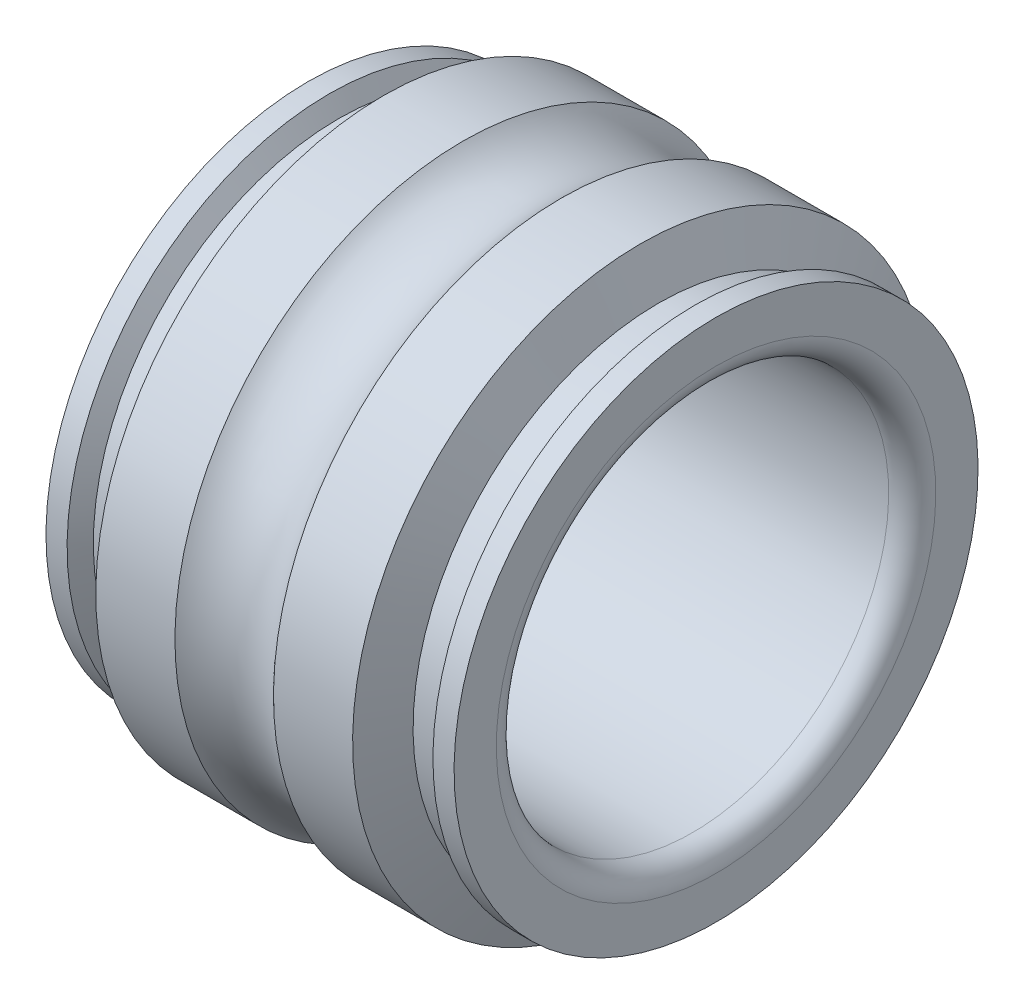
ISO-10303-21;
HEADER;
FILE_DESCRIPTION(('STEP AP214'),'2;1');
FILE_NAME('part.step','',(''),(''),'','','');
FILE_SCHEMA(('AUTOMOTIVE_DESIGN { 1 0 10303 214 1 1 1 1 }'));
ENDSEC;
DATA;
#1=APPLICATION_CONTEXT('core data for automotive mechanical design processes');
#2=APPLICATION_PROTOCOL_DEFINITION('international standard','automotive_design',2000,#1);
#3=PRODUCT_CONTEXT('',#1,'mechanical');
#4=PRODUCT('Part','Part','',(#3));
#5=PRODUCT_RELATED_PRODUCT_CATEGORY('part','',(#4));
#6=PRODUCT_DEFINITION_FORMATION('','',#4);
#7=PRODUCT_DEFINITION_CONTEXT('part definition',#1,'design');
#8=PRODUCT_DEFINITION('design','',#6,#7);
#9=PRODUCT_DEFINITION_SHAPE('','',#8);
#10=(LENGTH_UNIT() NAMED_UNIT(*) SI_UNIT(.MILLI.,.METRE.));
#11=(NAMED_UNIT(*) PLANE_ANGLE_UNIT() SI_UNIT($,.RADIAN.));
#12=(NAMED_UNIT(*) SI_UNIT($,.STERADIAN.) SOLID_ANGLE_UNIT());
#13=UNCERTAINTY_MEASURE_WITH_UNIT(LENGTH_MEASURE(1.E-05),#10,'distance_accuracy_value','');
#14=(GEOMETRIC_REPRESENTATION_CONTEXT(3) GLOBAL_UNCERTAINTY_ASSIGNED_CONTEXT((#13)) GLOBAL_UNIT_ASSIGNED_CONTEXT((#10,
#11,#12)) REPRESENTATION_CONTEXT('',''));
#15=CARTESIAN_POINT('',(0.,0.,0.));
#16=DIRECTION('',(0.,0.,1.));
#17=DIRECTION('',(1.,0.,0.));
#18=AXIS2_PLACEMENT_3D('',#15,#16,#17);
#19=CARTESIAN_POINT('',(-1.01853146853147,0.,0.));
#20=DIRECTION('',(-1.,0.,0.));
#21=DIRECTION('',(0.,1.,0.));
#22=AXIS2_PLACEMENT_3D('',#19,#20,#21);
#23=CYLINDRICAL_SURFACE('',#22,1.56324863939701);
#24=CARTESIAN_POINT('',(-1.1041958041958,0.,0.));
#25=DIRECTION('',(1.,0.,0.));
#26=DIRECTION('',(0.,1.,0.));
#27=AXIS2_PLACEMENT_3D('',#24,#25,#26);
#28=CIRCLE('',#27,1.56324863939701);
#29=CARTESIAN_POINT('',(-1.1041958041958,1.56324863939701,0.));
#30=VERTEX_POINT('',#29);
#31=EDGE_CURVE('E11',#30,#30,#28,.T.);
#32=ORIENTED_EDGE('',*,*,#31,.T.);
#33=EDGE_LOOP('',(#32));
#34=FACE_BOUND('',#33,.T.);
#35=CARTESIAN_POINT('',(-0.932867132867133,0.,0.));
#36=DIRECTION('',(1.,0.,0.));
#37=DIRECTION('',(0.,1.,0.));
#38=AXIS2_PLACEMENT_3D('',#35,#36,#37);
#39=CIRCLE('',#38,1.56324863939701);
#40=CARTESIAN_POINT('',(-0.932867132867133,1.56324863939701,0.));
#41=VERTEX_POINT('',#40);
#42=EDGE_CURVE('E56',#41,#41,#39,.T.);
#43=ORIENTED_EDGE('',*,*,#42,.F.);
#44=EDGE_LOOP('',(#43));
#45=FACE_BOUND('',#44,.T.);
#46=ADVANCED_FACE('F19',(#34,#45),#23,.T.);
#47=CARTESIAN_POINT('',(-1.13479020979021,0.,0.));
#48=DIRECTION('',(-1.,0.,0.));
#49=DIRECTION('',(0.,1.,0.));
#50=AXIS2_PLACEMENT_3D('',#47,#48,#49);
#51=CONICAL_SURFACE('',#50,1.61623970431389,1.0471975511966);
#52=CARTESIAN_POINT('',(-1.16538461538462,0.,0.));
#53=DIRECTION('',(1.,0.,0.));
#54=DIRECTION('',(0.,1.,0.));
#55=AXIS2_PLACEMENT_3D('',#52,#53,#54);
#56=CIRCLE('',#55,1.66923076923077);
#57=CARTESIAN_POINT('',(-1.16538461538462,1.66923076923077,0.));
#58=VERTEX_POINT('',#57);
#59=EDGE_CURVE('E29',#58,#58,#56,.T.);
#60=ORIENTED_EDGE('',*,*,#59,.T.);
#61=EDGE_LOOP('',(#60));
#62=FACE_BOUND('',#61,.T.);
#63=ORIENTED_EDGE('',*,*,#31,.F.);
#64=EDGE_LOOP('',(#63));
#65=FACE_BOUND('',#64,.T.);
#66=ADVANCED_FACE('F121',(#62,#65),#51,.T.);
#67=CARTESIAN_POINT('',(-1.23269230769231,0.,0.));
#68=DIRECTION('',(-1.,0.,0.));
#69=DIRECTION('',(0.,1.,0.));
#70=AXIS2_PLACEMENT_3D('',#67,#68,#69);
#71=CYLINDRICAL_SURFACE('',#70,1.66923076923077);
#72=CARTESIAN_POINT('',(-1.3,0.,0.));
#73=DIRECTION('',(1.,0.,0.));
#74=DIRECTION('',(0.,1.,0.));
#75=AXIS2_PLACEMENT_3D('',#72,#73,#74);
#76=CIRCLE('',#75,1.66923076923077);
#77=CARTESIAN_POINT('',(-1.3,1.66923076923077,0.));
#78=VERTEX_POINT('',#77);
#79=EDGE_CURVE('E70',#78,#78,#76,.T.);
#80=ORIENTED_EDGE('',*,*,#79,.T.);
#81=EDGE_LOOP('',(#80));
#82=FACE_BOUND('',#81,.T.);
#83=ORIENTED_EDGE('',*,*,#59,.F.);
#84=EDGE_LOOP('',(#83));
#85=FACE_BOUND('',#84,.T.);
#86=ADVANCED_FACE('F126',(#82,#85),#71,.T.);
#87=CARTESIAN_POINT('',(-1.3,1.53461538461538,0.));
#88=DIRECTION('',(-1.,0.,0.));
#89=DIRECTION('',(0.,-1.,0.));
#90=AXIS2_PLACEMENT_3D('',#87,#88,#89);
#91=PLANE('',#90);
#92=CARTESIAN_POINT('',(-1.3,0.,0.));
#93=DIRECTION('',(1.,0.,0.));
#94=DIRECTION('',(0.,1.,0.));
#95=AXIS2_PLACEMENT_3D('',#92,#93,#94);
#96=CIRCLE('',#95,1.4);
#97=CARTESIAN_POINT('',(-1.3,1.4,0.));
#98=VERTEX_POINT('',#97);
#99=EDGE_CURVE('E82',#98,#98,#96,.T.);
#100=ORIENTED_EDGE('',*,*,#99,.T.);
#101=EDGE_LOOP('',(#100));
#102=FACE_BOUND('',#101,.T.);
#103=ORIENTED_EDGE('',*,*,#79,.F.);
#104=EDGE_LOOP('',(#103));
#105=FACE_BOUND('',#104,.T.);
#106=ADVANCED_FACE('F155',(#102,#105),#91,.T.);
#107=CARTESIAN_POINT('',(-1.15,0.,0.));
#108=DIRECTION('',(1.,0.,0.));
#109=DIRECTION('',(0.,0.,-1.));
#110=AXIS2_PLACEMENT_3D('',#107,#108,#109);
#111=TOROIDAL_SURFACE('',#110,1.4,0.15);
#112=CARTESIAN_POINT('',(-1.15,0.,0.));
#113=DIRECTION('',(1.,0.,0.));
#114=DIRECTION('',(0.,1.,0.));
#115=AXIS2_PLACEMENT_3D('',#112,#113,#114);
#116=CIRCLE('',#115,1.25);
#117=CARTESIAN_POINT('',(-1.15,1.25,0.));
#118=VERTEX_POINT('',#117);
#119=EDGE_CURVE('E84',#118,#118,#116,.T.);
#120=ORIENTED_EDGE('',*,*,#119,.T.);
#121=EDGE_LOOP('',(#120));
#122=FACE_BOUND('',#121,.T.);
#123=ORIENTED_EDGE('',*,*,#99,.F.);
#124=EDGE_LOOP('',(#123));
#125=FACE_BOUND('',#124,.T.);
#126=ADVANCED_FACE('F134',(#122,#125),#111,.T.);
#127=CARTESIAN_POINT('',(0.,0.,0.));
#128=DIRECTION('',(-1.,0.,0.));
#129=DIRECTION('',(0.,1.,0.));
#130=AXIS2_PLACEMENT_3D('',#127,#128,#129);
#131=CYLINDRICAL_SURFACE('',#130,1.25);
#132=CARTESIAN_POINT('',(1.15,0.,0.));
#133=DIRECTION('',(1.,0.,0.));
#134=DIRECTION('',(0.,1.,0.));
#135=AXIS2_PLACEMENT_3D('',#132,#133,#134);
#136=CIRCLE('',#135,1.25);
#137=CARTESIAN_POINT('',(1.15,1.25,0.));
#138=VERTEX_POINT('',#137);
#139=EDGE_CURVE('E87',#138,#138,#136,.T.);
#140=ORIENTED_EDGE('',*,*,#139,.T.);
#141=EDGE_LOOP('',(#140));
#142=FACE_BOUND('',#141,.T.);
#143=ORIENTED_EDGE('',*,*,#119,.F.);
#144=EDGE_LOOP('',(#143));
#145=FACE_BOUND('',#144,.T.);
#146=ADVANCED_FACE('F131',(#142,#145),#131,.F.);
#147=CARTESIAN_POINT('',(1.15,0.,0.));
#148=DIRECTION('',(1.,0.,0.));
#149=DIRECTION('',(0.,0.,-1.));
#150=AXIS2_PLACEMENT_3D('',#147,#148,#149);
#151=TOROIDAL_SURFACE('',#150,1.4,0.15);
#152=CARTESIAN_POINT('',(1.3,0.,0.));
#153=DIRECTION('',(1.,0.,0.));
#154=DIRECTION('',(0.,1.,0.));
#155=AXIS2_PLACEMENT_3D('',#152,#153,#154);
#156=CIRCLE('',#155,1.4);
#157=CARTESIAN_POINT('',(1.3,1.4,0.));
#158=VERTEX_POINT('',#157);
#159=EDGE_CURVE('E89',#158,#158,#156,.T.);
#160=ORIENTED_EDGE('',*,*,#159,.T.);
#161=EDGE_LOOP('',(#160));
#162=FACE_BOUND('',#161,.T.);
#163=ORIENTED_EDGE('',*,*,#139,.F.);
#164=EDGE_LOOP('',(#163));
#165=FACE_BOUND('',#164,.T.);
#166=ADVANCED_FACE('F133',(#162,#165),#151,.T.);
#167=CARTESIAN_POINT('',(1.3,1.53461538461538,0.));
#168=DIRECTION('',(1.,0.,0.));
#169=DIRECTION('',(0.,1.,0.));
#170=AXIS2_PLACEMENT_3D('',#167,#168,#169);
#171=PLANE('',#170);
#172=CARTESIAN_POINT('',(1.3,0.,0.));
#173=DIRECTION('',(1.,0.,0.));
#174=DIRECTION('',(0.,1.,0.));
#175=AXIS2_PLACEMENT_3D('',#172,#173,#174);
#176=CIRCLE('',#175,1.66923076923077);
#177=CARTESIAN_POINT('',(1.3,1.66923076923077,0.));
#178=VERTEX_POINT('',#177);
#179=EDGE_CURVE('E80',#178,#178,#176,.T.);
#180=ORIENTED_EDGE('',*,*,#179,.T.);
#181=EDGE_LOOP('',(#180));
#182=FACE_BOUND('',#181,.T.);
#183=ORIENTED_EDGE('',*,*,#159,.F.);
#184=EDGE_LOOP('',(#183));
#185=FACE_BOUND('',#184,.T.);
#186=ADVANCED_FACE('F137',(#182,#185),#171,.T.);
#187=CARTESIAN_POINT('',(1.23269230769231,0.,0.));
#188=DIRECTION('',(-1.,0.,0.));
#189=DIRECTION('',(0.,1.,0.));
#190=AXIS2_PLACEMENT_3D('',#187,#188,#189);
#191=CYLINDRICAL_SURFACE('',#190,1.66923076923077);
#192=CARTESIAN_POINT('',(1.16538461538461,0.,0.));
#193=DIRECTION('',(1.,0.,0.));
#194=DIRECTION('',(0.,1.,0.));
#195=AXIS2_PLACEMENT_3D('',#192,#193,#194);
#196=CIRCLE('',#195,1.66923076923077);
#197=CARTESIAN_POINT('',(1.16538461538462,1.66923076923077,0.));
#198=VERTEX_POINT('',#197);
#199=EDGE_CURVE('E77',#198,#198,#196,.T.);
#200=ORIENTED_EDGE('',*,*,#199,.T.);
#201=EDGE_LOOP('',(#200));
#202=FACE_BOUND('',#201,.T.);
#203=ORIENTED_EDGE('',*,*,#179,.F.);
#204=EDGE_LOOP('',(#203));
#205=FACE_BOUND('',#204,.T.);
#206=ADVANCED_FACE('F142',(#202,#205),#191,.T.);
#207=CARTESIAN_POINT('',(1.13479020979021,0.,0.));
#208=DIRECTION('',(1.,0.,0.));
#209=DIRECTION('',(0.,1.,0.));
#210=AXIS2_PLACEMENT_3D('',#207,#208,#209);
#211=CONICAL_SURFACE('',#210,1.61623970431389,1.0471975511966);
#212=CARTESIAN_POINT('',(1.1041958041958,0.,0.));
#213=DIRECTION('',(1.,0.,0.));
#214=DIRECTION('',(0.,1.,0.));
#215=AXIS2_PLACEMENT_3D('',#212,#213,#214);
#216=CIRCLE('',#215,1.56324863939701);
#217=CARTESIAN_POINT('',(1.1041958041958,1.56324863939701,0.));
#218=VERTEX_POINT('',#217);
#219=EDGE_CURVE('E81',#218,#218,#216,.T.);
#220=ORIENTED_EDGE('',*,*,#219,.T.);
#221=EDGE_LOOP('',(#220));
#222=FACE_BOUND('',#221,.T.);
#223=ORIENTED_EDGE('',*,*,#199,.F.);
#224=EDGE_LOOP('',(#223));
#225=FACE_BOUND('',#224,.T.);
#226=ADVANCED_FACE('F116',(#222,#225),#211,.T.);
#227=CARTESIAN_POINT('',(1.01853146853147,0.,0.));
#228=DIRECTION('',(-1.,0.,0.));
#229=DIRECTION('',(0.,1.,0.));
#230=AXIS2_PLACEMENT_3D('',#227,#228,#229);
#231=CYLINDRICAL_SURFACE('',#230,1.56324863939701);
#232=CARTESIAN_POINT('',(0.932867132867133,0.,0.));
#233=DIRECTION('',(1.,0.,0.));
#234=DIRECTION('',(0.,1.,0.));
#235=AXIS2_PLACEMENT_3D('',#232,#233,#234);
#236=CIRCLE('',#235,1.56324863939701);
#237=CARTESIAN_POINT('',(0.932867132867133,1.56324863939701,0.));
#238=VERTEX_POINT('',#237);
#239=EDGE_CURVE('E23',#238,#238,#236,.T.);
#240=ORIENTED_EDGE('',*,*,#239,.T.);
#241=EDGE_LOOP('',(#240));
#242=FACE_BOUND('',#241,.T.);
#243=ORIENTED_EDGE('',*,*,#219,.F.);
#244=EDGE_LOOP('',(#243));
#245=FACE_BOUND('',#244,.T.);
#246=ADVANCED_FACE('F100',(#242,#245),#231,.T.);
#247=CARTESIAN_POINT('',(0.875487037075002,0.,0.));
#248=DIRECTION('',(-1.,0.,0.));
#249=DIRECTION('',(0.,1.,0.));
#250=AXIS2_PLACEMENT_3D('',#247,#248,#249);
#251=CONICAL_SURFACE('',#250,1.6984276738201,1.1693705988362);
#252=CARTESIAN_POINT('',(0.818106941282871,0.,0.));
#253=DIRECTION('',(1.,0.,0.));
#254=DIRECTION('',(0.,1.,0.));
#255=AXIS2_PLACEMENT_3D('',#252,#253,#254);
#256=CIRCLE('',#255,1.83360670824318);
#257=CARTESIAN_POINT('',(0.818106941282871,1.83360670824318,0.));
#258=VERTEX_POINT('',#257);
#259=EDGE_CURVE('E74',#258,#258,#256,.T.);
#260=ORIENTED_EDGE('',*,*,#259,.T.);
#261=EDGE_LOOP('',(#260));
#262=FACE_BOUND('',#261,.T.);
#263=ORIENTED_EDGE('',*,*,#239,.F.);
#264=EDGE_LOOP('',(#263));
#265=FACE_BOUND('',#264,.T.);
#266=ADVANCED_FACE('F104',(#262,#265),#251,.T.);
#267=CARTESIAN_POINT('',(0.566016372022163,0.,0.));
#268=DIRECTION('',(-1.,0.,0.));
#269=DIRECTION('',(0.,1.,0.));
#270=AXIS2_PLACEMENT_3D('',#267,#268,#269);
#271=CYLINDRICAL_SURFACE('',#270,1.83360670824318);
#272=CARTESIAN_POINT('',(0.313925802761455,0.,0.));
#273=DIRECTION('',(1.,0.,0.));
#274=DIRECTION('',(0.,1.,0.));
#275=AXIS2_PLACEMENT_3D('',#272,#273,#274);
#276=CIRCLE('',#275,1.83360670824318);
#277=CARTESIAN_POINT('',(0.313925802761455,1.83360670824318,0.));
#278=VERTEX_POINT('',#277);
#279=EDGE_CURVE('E72',#278,#278,#276,.T.);
#280=ORIENTED_EDGE('',*,*,#279,.T.);
#281=EDGE_LOOP('',(#280));
#282=FACE_BOUND('',#281,.T.);
#283=ORIENTED_EDGE('',*,*,#259,.F.);
#284=EDGE_LOOP('',(#283));
#285=FACE_BOUND('',#284,.T.);
#286=ADVANCED_FACE('F106',(#282,#285),#271,.T.);
#287=CARTESIAN_POINT('',(0.,0.,0.));
#288=DIRECTION('',(1.,0.,0.));
#289=DIRECTION('',(0.,0.,-1.));
#290=AXIS2_PLACEMENT_3D('',#287,#288,#289);
#291=TOROIDAL_SURFACE('',#290,2.125,0.428321678321679);
#292=CARTESIAN_POINT('',(-0.313925802761456,0.,0.));
#293=DIRECTION('',(1.,0.,0.));
#294=DIRECTION('',(0.,1.,0.));
#295=AXIS2_PLACEMENT_3D('',#292,#293,#294);
#296=CIRCLE('',#295,1.83360670824318);
#297=CARTESIAN_POINT('',(-0.313925802761456,1.83360670824318,0.));
#298=VERTEX_POINT('',#297);
#299=EDGE_CURVE('E66',#298,#298,#296,.T.);
#300=ORIENTED_EDGE('',*,*,#299,.T.);
#301=EDGE_LOOP('',(#300));
#302=FACE_BOUND('',#301,.T.);
#303=ORIENTED_EDGE('',*,*,#279,.F.);
#304=EDGE_LOOP('',(#303));
#305=FACE_BOUND('',#304,.T.);
#306=ADVANCED_FACE('F114',(#302,#305),#291,.F.);
#307=CARTESIAN_POINT('',(-0.566016372022163,0.,0.));
#308=DIRECTION('',(-1.,0.,0.));
#309=DIRECTION('',(0.,1.,0.));
#310=AXIS2_PLACEMENT_3D('',#307,#308,#309);
#311=CYLINDRICAL_SURFACE('',#310,1.83360670824318);
#312=CARTESIAN_POINT('',(-0.818106941282871,0.,0.));
#313=DIRECTION('',(1.,0.,0.));
#314=DIRECTION('',(0.,1.,0.));
#315=AXIS2_PLACEMENT_3D('',#312,#313,#314);
#316=CIRCLE('',#315,1.83360670824318);
#317=CARTESIAN_POINT('',(-0.818106941282871,1.83360670824318,0.));
#318=VERTEX_POINT('',#317);
#319=EDGE_CURVE('E62',#318,#318,#316,.T.);
#320=ORIENTED_EDGE('',*,*,#319,.T.);
#321=EDGE_LOOP('',(#320));
#322=FACE_BOUND('',#321,.T.);
#323=ORIENTED_EDGE('',*,*,#299,.F.);
#324=EDGE_LOOP('',(#323));
#325=FACE_BOUND('',#324,.T.);
#326=ADVANCED_FACE('F21',(#322,#325),#311,.T.);
#327=CARTESIAN_POINT('',(-0.875487037075002,0.,0.));
#328=DIRECTION('',(1.,0.,0.));
#329=DIRECTION('',(0.,1.,0.));
#330=AXIS2_PLACEMENT_3D('',#327,#328,#329);
#331=CONICAL_SURFACE('',#330,1.6984276738201,1.1693705988362);
#332=ORIENTED_EDGE('',*,*,#42,.T.);
#333=EDGE_LOOP('',(#332));
#334=FACE_BOUND('',#333,.T.);
#335=ORIENTED_EDGE('',*,*,#319,.F.);
#336=EDGE_LOOP('',(#335));
#337=FACE_BOUND('',#336,.T.);
#338=ADVANCED_FACE('F180',(#334,#337),#331,.T.);
#339=CLOSED_SHELL('',(#46,#66,#86,#106,#126,#146,#166,#186,#206,#226,#246,#266,#286,#306,#326,#338));
#340=MANIFOLD_SOLID_BREP('B1',#339);
#341=ADVANCED_BREP_SHAPE_REPRESENTATION('',(#18,#340),#14);
#342=SHAPE_DEFINITION_REPRESENTATION(#9,#341);
ENDSEC;
END-ISO-10303-21;
